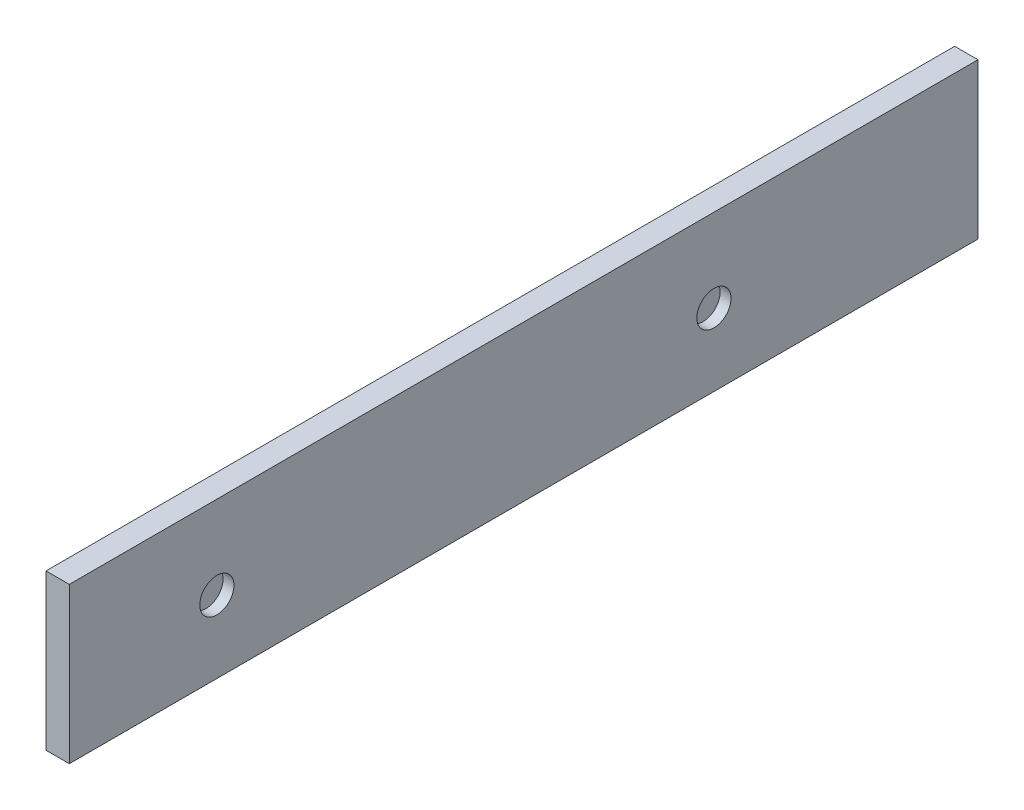
ISO-10303-21;
HEADER;
FILE_DESCRIPTION(('STEP AP214'),'2;1');
FILE_NAME('part.step','',(''),(''),'','','');
FILE_SCHEMA(('AUTOMOTIVE_DESIGN { 1 0 10303 214 1 1 1 1 }'));
ENDSEC;
DATA;
#1=APPLICATION_CONTEXT('core data for automotive mechanical design processes');
#2=APPLICATION_PROTOCOL_DEFINITION('international standard','automotive_design',2000,#1);
#3=PRODUCT_CONTEXT('',#1,'mechanical');
#4=PRODUCT('Part','Part','',(#3));
#5=PRODUCT_RELATED_PRODUCT_CATEGORY('part','',(#4));
#6=PRODUCT_DEFINITION_FORMATION('','',#4);
#7=PRODUCT_DEFINITION_CONTEXT('part definition',#1,'design');
#8=PRODUCT_DEFINITION('design','',#6,#7);
#9=PRODUCT_DEFINITION_SHAPE('','',#8);
#10=(LENGTH_UNIT() NAMED_UNIT(*) SI_UNIT(.MILLI.,.METRE.));
#11=(NAMED_UNIT(*) PLANE_ANGLE_UNIT() SI_UNIT($,.RADIAN.));
#12=(NAMED_UNIT(*) SI_UNIT($,.STERADIAN.) SOLID_ANGLE_UNIT());
#13=UNCERTAINTY_MEASURE_WITH_UNIT(LENGTH_MEASURE(1.E-05),#10,'distance_accuracy_value','');
#14=(GEOMETRIC_REPRESENTATION_CONTEXT(3) GLOBAL_UNCERTAINTY_ASSIGNED_CONTEXT((#13)) GLOBAL_UNIT_ASSIGNED_CONTEXT((#10,
#11,#12)) REPRESENTATION_CONTEXT('',''));
#15=CARTESIAN_POINT('',(0.,0.,0.));
#16=DIRECTION('',(0.,0.,1.));
#17=DIRECTION('',(1.,0.,0.));
#18=AXIS2_PLACEMENT_3D('',#15,#16,#17);
#19=CARTESIAN_POINT('',(15.,0.,0.));
#20=DIRECTION('',(0.,0.,-1.));
#21=DIRECTION('',(-1.,0.,0.));
#22=AXIS2_PLACEMENT_3D('',#19,#20,#21);
#23=PLANE('',#22);
#24=DIRECTION('',(0.,-1.,0.));
#25=VECTOR('',#24,1.);
#26=CARTESIAN_POINT('',(0.,0.,0.));
#27=LINE('',#26,#25);
#28=CARTESIAN_POINT('',(0.,100.,0.));
#29=VERTEX_POINT('',#28);
#30=CARTESIAN_POINT('',(0.,0.,0.));
#31=VERTEX_POINT('',#30);
#32=EDGE_CURVE('E96',#29,#31,#27,.T.);
#33=ORIENTED_EDGE('',*,*,#32,.T.);
#34=DIRECTION('',(-1.,0.,0.));
#35=VECTOR('',#34,1.);
#36=CARTESIAN_POINT('',(15.,0.,0.));
#37=LINE('',#36,#35);
#38=CARTESIAN_POINT('',(15.,0.,0.));
#39=VERTEX_POINT('',#38);
#40=EDGE_CURVE('E11',#39,#31,#37,.T.);
#41=ORIENTED_EDGE('',*,*,#40,.F.);
#42=DIRECTION('',(0.,-1.,0.));
#43=VECTOR('',#42,1.);
#44=CARTESIAN_POINT('',(15.,0.,0.));
#45=LINE('',#44,#43);
#46=CARTESIAN_POINT('',(15.,100.,0.));
#47=VERTEX_POINT('',#46);
#48=EDGE_CURVE('E84',#47,#39,#45,.T.);
#49=ORIENTED_EDGE('',*,*,#48,.F.);
#50=DIRECTION('',(-1.,0.,0.));
#51=VECTOR('',#50,1.);
#52=CARTESIAN_POINT('',(15.,100.,0.));
#53=LINE('',#52,#51);
#54=EDGE_CURVE('E92',#47,#29,#53,.T.);
#55=ORIENTED_EDGE('',*,*,#54,.T.);
#56=EDGE_LOOP('',(#33,#41,#49,#55));
#57=FACE_BOUND('',#56,.T.);
#58=ADVANCED_FACE('F33',(#57),#23,.F.);
#59=CARTESIAN_POINT('',(15.,0.,0.));
#60=DIRECTION('',(0.,1.,0.));
#61=DIRECTION('',(0.,0.,1.));
#62=AXIS2_PLACEMENT_3D('',#59,#60,#61);
#63=PLANE('',#62);
#64=DIRECTION('',(0.,0.,-1.));
#65=VECTOR('',#64,1.);
#66=CARTESIAN_POINT('',(0.,0.,0.));
#67=LINE('',#66,#65);
#68=CARTESIAN_POINT('',(0.,0.,-585.));
#69=VERTEX_POINT('',#68);
#70=EDGE_CURVE('E88',#31,#69,#67,.T.);
#71=ORIENTED_EDGE('',*,*,#70,.T.);
#72=DIRECTION('',(-1.,0.,0.));
#73=VECTOR('',#72,1.);
#74=CARTESIAN_POINT('',(15.,0.,-585.));
#75=LINE('',#74,#73);
#76=CARTESIAN_POINT('',(15.,0.,-585.));
#77=VERTEX_POINT('',#76);
#78=EDGE_CURVE('E41',#77,#69,#75,.T.);
#79=ORIENTED_EDGE('',*,*,#78,.F.);
#80=DIRECTION('',(0.,0.,-1.));
#81=VECTOR('',#80,1.);
#82=CARTESIAN_POINT('',(15.,0.,0.));
#83=LINE('',#82,#81);
#84=EDGE_CURVE('E79',#39,#77,#83,.T.);
#85=ORIENTED_EDGE('',*,*,#84,.F.);
#86=ORIENTED_EDGE('',*,*,#40,.T.);
#87=EDGE_LOOP('',(#71,#79,#85,#86));
#88=FACE_BOUND('',#87,.T.);
#89=ADVANCED_FACE('F87',(#88),#63,.F.);
#90=CARTESIAN_POINT('',(15.,0.,-585.));
#91=DIRECTION('',(0.,0.,1.));
#92=DIRECTION('',(1.,0.,0.));
#93=AXIS2_PLACEMENT_3D('',#90,#91,#92);
#94=PLANE('',#93);
#95=DIRECTION('',(0.,1.,0.));
#96=VECTOR('',#95,1.);
#97=CARTESIAN_POINT('',(0.,0.,-585.));
#98=LINE('',#97,#96);
#99=CARTESIAN_POINT('',(0.,100.,-585.));
#100=VERTEX_POINT('',#99);
#101=EDGE_CURVE('E66',#69,#100,#98,.T.);
#102=ORIENTED_EDGE('',*,*,#101,.T.);
#103=DIRECTION('',(-1.,0.,0.));
#104=VECTOR('',#103,1.);
#105=CARTESIAN_POINT('',(15.,100.,-585.));
#106=LINE('',#105,#104);
#107=CARTESIAN_POINT('',(15.,100.,-585.));
#108=VERTEX_POINT('',#107);
#109=EDGE_CURVE('E89',#108,#100,#106,.T.);
#110=ORIENTED_EDGE('',*,*,#109,.F.);
#111=DIRECTION('',(0.,1.,0.));
#112=VECTOR('',#111,1.);
#113=CARTESIAN_POINT('',(15.,0.,-585.));
#114=LINE('',#113,#112);
#115=EDGE_CURVE('E82',#77,#108,#114,.T.);
#116=ORIENTED_EDGE('',*,*,#115,.F.);
#117=ORIENTED_EDGE('',*,*,#78,.T.);
#118=EDGE_LOOP('',(#102,#110,#116,#117));
#119=FACE_BOUND('',#118,.T.);
#120=ADVANCED_FACE('F90',(#119),#94,.F.);
#121=CARTESIAN_POINT('',(15.,100.,0.));
#122=DIRECTION('',(0.,-1.,0.));
#123=DIRECTION('',(0.,0.,-1.));
#124=AXIS2_PLACEMENT_3D('',#121,#122,#123);
#125=PLANE('',#124);
#126=DIRECTION('',(0.,0.,1.));
#127=VECTOR('',#126,1.);
#128=CARTESIAN_POINT('',(0.,100.,0.));
#129=LINE('',#128,#127);
#130=EDGE_CURVE('E72',#100,#29,#129,.T.);
#131=ORIENTED_EDGE('',*,*,#130,.T.);
#132=ORIENTED_EDGE('',*,*,#54,.F.);
#133=DIRECTION('',(0.,0.,1.));
#134=VECTOR('',#133,1.);
#135=CARTESIAN_POINT('',(15.,100.,0.));
#136=LINE('',#135,#134);
#137=EDGE_CURVE('E49',#108,#47,#136,.T.);
#138=ORIENTED_EDGE('',*,*,#137,.F.);
#139=ORIENTED_EDGE('',*,*,#109,.T.);
#140=EDGE_LOOP('',(#131,#132,#138,#139));
#141=FACE_BOUND('',#140,.T.);
#142=ADVANCED_FACE('F104',(#141),#125,.F.);
#143=CARTESIAN_POINT('',(15.,0.,0.));
#144=DIRECTION('',(-1.,0.,0.));
#145=DIRECTION('',(0.,0.,1.));
#146=AXIS2_PLACEMENT_3D('',#143,#144,#145);
#147=PLANE('',#146);
#148=CARTESIAN_POINT('',(15.,46.5,-415.));
#149=DIRECTION('',(1.,0.,0.));
#150=DIRECTION('',(0.,0.,-1.));
#151=AXIS2_PLACEMENT_3D('',#148,#149,#150);
#152=CIRCLE('',#151,11.0000000000001);
#153=CARTESIAN_POINT('',(15.,46.5,-426.));
#154=VERTEX_POINT('',#153);
#155=EDGE_CURVE('E116',#154,#154,#152,.T.);
#156=ORIENTED_EDGE('',*,*,#155,.F.);
#157=EDGE_LOOP('',(#156));
#158=FACE_BOUND('',#157,.T.);
#159=CARTESIAN_POINT('',(15.,46.5,-94.9999999999999));
#160=DIRECTION('',(1.,0.,0.));
#161=DIRECTION('',(0.,0.,-1.));
#162=AXIS2_PLACEMENT_3D('',#159,#160,#161);
#163=CIRCLE('',#162,11.);
#164=CARTESIAN_POINT('',(15.,46.5,-106.));
#165=VERTEX_POINT('',#164);
#166=EDGE_CURVE('E110',#165,#165,#163,.T.);
#167=ORIENTED_EDGE('',*,*,#166,.F.);
#168=EDGE_LOOP('',(#167));
#169=FACE_BOUND('',#168,.T.);
#170=ORIENTED_EDGE('',*,*,#48,.T.);
#171=ORIENTED_EDGE('',*,*,#84,.T.);
#172=ORIENTED_EDGE('',*,*,#115,.T.);
#173=ORIENTED_EDGE('',*,*,#137,.T.);
#174=EDGE_LOOP('',(#170,#171,#172,#173));
#175=FACE_BOUND('',#174,.T.);
#176=ADVANCED_FACE('F80',(#158,#169,#175),#147,.F.);
#177=CARTESIAN_POINT('',(0.,0.,0.));
#178=DIRECTION('',(-1.,0.,0.));
#179=DIRECTION('',(0.,0.,1.));
#180=AXIS2_PLACEMENT_3D('',#177,#178,#179);
#181=PLANE('',#180);
#182=ORIENTED_EDGE('',*,*,#32,.F.);
#183=ORIENTED_EDGE('',*,*,#130,.F.);
#184=ORIENTED_EDGE('',*,*,#101,.F.);
#185=ORIENTED_EDGE('',*,*,#70,.F.);
#186=EDGE_LOOP('',(#182,#183,#184,#185));
#187=FACE_BOUND('',#186,.T.);
#188=ADVANCED_FACE('F107',(#187),#181,.T.);
#189=CARTESIAN_POINT('',(8.,46.5,-94.9999999999999));
#190=DIRECTION('',(1.,0.,0.));
#191=DIRECTION('',(0.,0.,-1.));
#192=AXIS2_PLACEMENT_3D('',#189,#190,#191);
#193=CYLINDRICAL_SURFACE('',#192,11.);
#194=CARTESIAN_POINT('',(8.,46.5,-94.9999999999999));
#195=DIRECTION('',(1.,0.,0.));
#196=DIRECTION('',(0.,0.,-1.));
#197=AXIS2_PLACEMENT_3D('',#194,#195,#196);
#198=CIRCLE('',#197,11.);
#199=CARTESIAN_POINT('',(8.,46.5,-106.));
#200=VERTEX_POINT('',#199);
#201=EDGE_CURVE('E99',#200,#200,#198,.T.);
#202=ORIENTED_EDGE('',*,*,#201,.F.);
#203=EDGE_LOOP('',(#202));
#204=FACE_BOUND('',#203,.T.);
#205=ORIENTED_EDGE('',*,*,#166,.T.);
#206=EDGE_LOOP('',(#205));
#207=FACE_BOUND('',#206,.T.);
#208=ADVANCED_FACE('F136',(#204,#207),#193,.F.);
#209=CARTESIAN_POINT('',(8.,46.5,-94.9999999999999));
#210=DIRECTION('',(1.,0.,0.));
#211=DIRECTION('',(0.,0.,-1.));
#212=AXIS2_PLACEMENT_3D('',#209,#210,#211);
#213=PLANE('',#212);
#214=ORIENTED_EDGE('',*,*,#201,.T.);
#215=EDGE_LOOP('',(#214));
#216=FACE_BOUND('',#215,.T.);
#217=ADVANCED_FACE('F127',(#216),#213,.T.);
#218=CARTESIAN_POINT('',(8.,46.5,-415.));
#219=DIRECTION('',(1.,0.,0.));
#220=DIRECTION('',(0.,0.,-1.));
#221=AXIS2_PLACEMENT_3D('',#218,#219,#220);
#222=CYLINDRICAL_SURFACE('',#221,11.0000000000001);
#223=CARTESIAN_POINT('',(8.,46.5,-415.));
#224=DIRECTION('',(1.,0.,0.));
#225=DIRECTION('',(0.,0.,-1.));
#226=AXIS2_PLACEMENT_3D('',#223,#224,#225);
#227=CIRCLE('',#226,11.0000000000001);
#228=CARTESIAN_POINT('',(8.,46.5,-426.));
#229=VERTEX_POINT('',#228);
#230=EDGE_CURVE('E113',#229,#229,#227,.T.);
#231=ORIENTED_EDGE('',*,*,#230,.F.);
#232=EDGE_LOOP('',(#231));
#233=FACE_BOUND('',#232,.T.);
#234=ORIENTED_EDGE('',*,*,#155,.T.);
#235=EDGE_LOOP('',(#234));
#236=FACE_BOUND('',#235,.T.);
#237=ADVANCED_FACE('F124',(#233,#236),#222,.F.);
#238=CARTESIAN_POINT('',(8.,46.5,-415.));
#239=DIRECTION('',(1.,0.,0.));
#240=DIRECTION('',(0.,0.,-1.));
#241=AXIS2_PLACEMENT_3D('',#238,#239,#240);
#242=PLANE('',#241);
#243=ORIENTED_EDGE('',*,*,#230,.T.);
#244=EDGE_LOOP('',(#243));
#245=FACE_BOUND('',#244,.T.);
#246=ADVANCED_FACE('F122',(#245),#242,.T.);
#247=CLOSED_SHELL('',(#58,#89,#120,#142,#176,#188,#208,#217,#237,#246));
#248=MANIFOLD_SOLID_BREP('B2',#247);
#249=ADVANCED_BREP_SHAPE_REPRESENTATION('',(#18,#248),#14);
#250=SHAPE_DEFINITION_REPRESENTATION(#9,#249);
ENDSEC;
END-ISO-10303-21;
